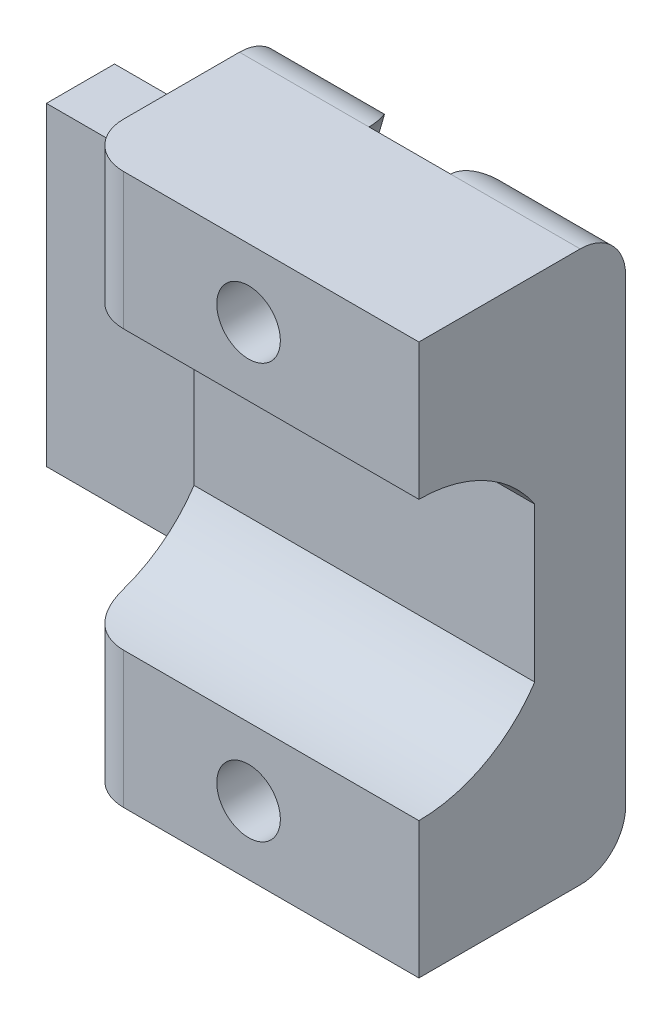
ISO-10303-21;
HEADER;
FILE_DESCRIPTION(('STEP AP214'),'2;1');
FILE_NAME('part.step','',(''),(''),'','','');
FILE_SCHEMA(('AUTOMOTIVE_DESIGN { 1 0 10303 214 1 1 1 1 }'));
ENDSEC;
DATA;
#1=APPLICATION_CONTEXT('core data for automotive mechanical design processes');
#2=APPLICATION_PROTOCOL_DEFINITION('international standard','automotive_design',2000,#1);
#3=PRODUCT_CONTEXT('',#1,'mechanical');
#4=PRODUCT('Part','Part','',(#3));
#5=PRODUCT_RELATED_PRODUCT_CATEGORY('part','',(#4));
#6=PRODUCT_DEFINITION_FORMATION('','',#4);
#7=PRODUCT_DEFINITION_CONTEXT('part definition',#1,'design');
#8=PRODUCT_DEFINITION('design','',#6,#7);
#9=PRODUCT_DEFINITION_SHAPE('','',#8);
#10=(LENGTH_UNIT() NAMED_UNIT(*) SI_UNIT(.MILLI.,.METRE.));
#11=(NAMED_UNIT(*) PLANE_ANGLE_UNIT() SI_UNIT($,.RADIAN.));
#12=(NAMED_UNIT(*) SI_UNIT($,.STERADIAN.) SOLID_ANGLE_UNIT());
#13=UNCERTAINTY_MEASURE_WITH_UNIT(LENGTH_MEASURE(1.E-05),#10,'distance_accuracy_value','');
#14=(GEOMETRIC_REPRESENTATION_CONTEXT(3) GLOBAL_UNCERTAINTY_ASSIGNED_CONTEXT((#13)) GLOBAL_UNIT_ASSIGNED_CONTEXT((#10,
#11,#12)) REPRESENTATION_CONTEXT('',''));
#15=CARTESIAN_POINT('',(0.,0.,0.));
#16=DIRECTION('',(0.,0.,1.));
#17=DIRECTION('',(1.,0.,0.));
#18=AXIS2_PLACEMENT_3D('',#15,#16,#17);
#19=CARTESIAN_POINT('',(-51.2,12.125,0.));
#20=DIRECTION('',(0.,0.,-1.));
#21=DIRECTION('',(0.,1.,0.));
#22=AXIS2_PLACEMENT_3D('',#19,#20,#21);
#23=PLANE('',#22);
#24=CARTESIAN_POINT('',(-7.50000000000001,9.12499999999999,0.));
#25=DIRECTION('',(0.,0.,-1.));
#26=DIRECTION('',(0.,1.,0.));
#27=AXIS2_PLACEMENT_3D('',#24,#25,#26);
#28=CIRCLE('',#27,1.4);
#29=CARTESIAN_POINT('',(-7.50000000000001,10.525,0.));
#30=VERTEX_POINT('',#29);
#31=EDGE_CURVE('E280',#30,#30,#28,.F.);
#32=ORIENTED_EDGE('',*,*,#31,.F.);
#33=EDGE_LOOP('',(#32));
#34=FACE_BOUND('',#33,.T.);
#35=DIRECTION('',(1.,0.,0.));
#36=VECTOR('',#35,1.);
#37=CARTESIAN_POINT('',(-51.2,12.125,0.));
#38=LINE('',#37,#36);
#39=CARTESIAN_POINT('',(-13.,12.125,0.));
#40=VERTEX_POINT('',#39);
#41=CARTESIAN_POINT('',(0.,12.125,0.));
#42=VERTEX_POINT('',#41);
#43=EDGE_CURVE('E269',#40,#42,#38,.T.);
#44=ORIENTED_EDGE('',*,*,#43,.F.);
#45=DIRECTION('',(0.,1.,0.));
#46=VECTOR('',#45,1.);
#47=CARTESIAN_POINT('',(-13.,12.125,0.));
#48=LINE('',#47,#46);
#49=CARTESIAN_POINT('',(-13.,6.125,0.));
#50=VERTEX_POINT('',#49);
#51=EDGE_CURVE('E64',#40,#50,#48,.F.);
#52=ORIENTED_EDGE('',*,*,#51,.T.);
#53=DIRECTION('',(1.,0.,0.));
#54=VECTOR('',#53,1.);
#55=CARTESIAN_POINT('',(-15.,6.125,0.));
#56=LINE('',#55,#54);
#57=CARTESIAN_POINT('',(0.,6.125,0.));
#58=VERTEX_POINT('',#57);
#59=EDGE_CURVE('E272',#58,#50,#56,.F.);
#60=ORIENTED_EDGE('',*,*,#59,.F.);
#61=DIRECTION('',(0.,1.,0.));
#62=VECTOR('',#61,1.);
#63=CARTESIAN_POINT('',(0.,12.125,0.));
#64=LINE('',#63,#62);
#65=EDGE_CURVE('E263',#58,#42,#64,.T.);
#66=ORIENTED_EDGE('',*,*,#65,.T.);
#67=EDGE_LOOP('',(#44,#52,#60,#66));
#68=FACE_BOUND('',#67,.T.);
#69=ADVANCED_FACE('F49',(#34,#68),#23,.F.);
#70=CARTESIAN_POINT('',(-7.5,-9.125,-9.1));
#71=DIRECTION('',(0.,0.,1.));
#72=DIRECTION('',(1.,0.,0.));
#73=AXIS2_PLACEMENT_3D('',#70,#71,#72);
#74=CYLINDRICAL_SURFACE('',#73,1.4);
#75=CARTESIAN_POINT('',(-7.5,-9.125,0.));
#76=DIRECTION('',(0.,0.,-1.));
#77=DIRECTION('',(0.,1.,0.));
#78=AXIS2_PLACEMENT_3D('',#75,#76,#77);
#79=CIRCLE('',#78,1.4);
#80=CARTESIAN_POINT('',(-7.5,-7.725,0.));
#81=VERTEX_POINT('',#80);
#82=EDGE_CURVE('E284',#81,#81,#79,.F.);
#83=ORIENTED_EDGE('',*,*,#82,.T.);
#84=EDGE_LOOP('',(#83));
#85=FACE_BOUND('',#84,.T.);
#86=CARTESIAN_POINT('',(-7.5,-9.125,-7.1));
#87=DIRECTION('',(0.,0.,-1.));
#88=DIRECTION('',(-1.,0.,0.));
#89=AXIS2_PLACEMENT_3D('',#86,#87,#88);
#90=CIRCLE('',#89,1.4);
#91=CARTESIAN_POINT('',(-8.9,-9.125,-7.1));
#92=VERTEX_POINT('',#91);
#93=EDGE_CURVE('E293',#92,#92,#90,.F.);
#94=ORIENTED_EDGE('',*,*,#93,.F.);
#95=EDGE_LOOP('',(#94));
#96=FACE_BOUND('',#95,.T.);
#97=ADVANCED_FACE('F421',(#85,#96),#74,.F.);
#98=CARTESIAN_POINT('',(-7.50000000000001,9.12499999999999,-9.1));
#99=DIRECTION('',(0.,0.,1.));
#100=DIRECTION('',(1.,0.,0.));
#101=AXIS2_PLACEMENT_3D('',#98,#99,#100);
#102=CYLINDRICAL_SURFACE('',#101,1.4);
#103=ORIENTED_EDGE('',*,*,#31,.T.);
#104=EDGE_LOOP('',(#103));
#105=FACE_BOUND('',#104,.T.);
#106=CARTESIAN_POINT('',(-7.50000000000001,9.12499999999999,-7.1));
#107=DIRECTION('',(0.,0.,1.));
#108=DIRECTION('',(1.,0.,0.));
#109=AXIS2_PLACEMENT_3D('',#106,#107,#108);
#110=CIRCLE('',#109,1.4);
#111=CARTESIAN_POINT('',(-6.10000000000001,9.12499999999999,-7.1));
#112=VERTEX_POINT('',#111);
#113=EDGE_CURVE('E309',#112,#112,#110,.F.);
#114=ORIENTED_EDGE('',*,*,#113,.T.);
#115=EDGE_LOOP('',(#114));
#116=FACE_BOUND('',#115,.T.);
#117=ADVANCED_FACE('F424',(#105,#116),#102,.F.);
#118=CARTESIAN_POINT('',(-15.,-12.125,9.1));
#119=DIRECTION('',(0.,-1.,0.));
#120=DIRECTION('',(0.,0.,-1.));
#121=AXIS2_PLACEMENT_3D('',#118,#119,#120);
#122=PLANE('',#121);
#123=DIRECTION('',(1.,0.,0.));
#124=VECTOR('',#123,1.);
#125=CARTESIAN_POINT('',(-51.2,-12.125,0.));
#126=LINE('',#125,#124);
#127=CARTESIAN_POINT('',(-13.,-12.125,0.));
#128=VERTEX_POINT('',#127);
#129=CARTESIAN_POINT('',(0.,-12.125,0.));
#130=VERTEX_POINT('',#129);
#131=EDGE_CURVE('E268',#128,#130,#126,.T.);
#132=ORIENTED_EDGE('',*,*,#131,.F.);
#133=CARTESIAN_POINT('',(-13.,-12.125,-2.));
#134=DIRECTION('',(0.,-1.,0.));
#135=DIRECTION('',(0.,0.,-1.));
#136=AXIS2_PLACEMENT_3D('',#133,#134,#135);
#137=CIRCLE('',#136,2.);
#138=CARTESIAN_POINT('',(-15.,-12.125,-2.));
#139=VERTEX_POINT('',#138);
#140=EDGE_CURVE('E510',#128,#139,#137,.T.);
#141=ORIENTED_EDGE('',*,*,#140,.T.);
#142=DIRECTION('',(0.,0.,1.));
#143=VECTOR('',#142,1.);
#144=CARTESIAN_POINT('',(-15.,-12.125,-9.1));
#145=LINE('',#144,#143);
#146=CARTESIAN_POINT('',(-15.,-12.125,-7.1));
#147=VERTEX_POINT('',#146);
#148=EDGE_CURVE('E204',#147,#139,#145,.T.);
#149=ORIENTED_EDGE('',*,*,#148,.F.);
#150=DIRECTION('',(1.,0.,0.));
#151=VECTOR('',#150,1.);
#152=CARTESIAN_POINT('',(-15.,-12.125,-7.1));
#153=LINE('',#152,#151);
#154=CARTESIAN_POINT('',(-9.30277563773199,-12.125,-7.1));
#155=VERTEX_POINT('',#154);
#156=EDGE_CURVE('E535',#147,#155,#153,.T.);
#157=ORIENTED_EDGE('',*,*,#156,.T.);
#158=DIRECTION('',(1.,0.,0.));
#159=VECTOR('',#158,1.);
#160=CARTESIAN_POINT('',(-15.,-12.125,-7.1));
#161=LINE('',#160,#159);
#162=CARTESIAN_POINT('',(-5.69722436226801,-12.125,-7.1));
#163=VERTEX_POINT('',#162);
#164=EDGE_CURVE('E305',#155,#163,#161,.T.);
#165=ORIENTED_EDGE('',*,*,#164,.T.);
#166=DIRECTION('',(1.,0.,0.));
#167=VECTOR('',#166,1.);
#168=CARTESIAN_POINT('',(-15.,-12.125,-7.1));
#169=LINE('',#168,#167);
#170=CARTESIAN_POINT('',(0.,-12.125,-7.1));
#171=VERTEX_POINT('',#170);
#172=EDGE_CURVE('E485',#163,#171,#169,.T.);
#173=ORIENTED_EDGE('',*,*,#172,.T.);
#174=DIRECTION('',(0.,0.,-1.));
#175=VECTOR('',#174,1.);
#176=CARTESIAN_POINT('',(0.,-12.125,9.1));
#177=LINE('',#176,#175);
#178=EDGE_CURVE('E342',#130,#171,#177,.T.);
#179=ORIENTED_EDGE('',*,*,#178,.F.);
#180=EDGE_LOOP('',(#132,#141,#149,#157,#165,#173,#179));
#181=FACE_BOUND('',#180,.T.);
#182=ADVANCED_FACE('F428',(#181),#122,.T.);
#183=CARTESIAN_POINT('',(-15.,12.125,9.1));
#184=DIRECTION('',(0.,1.,0.));
#185=DIRECTION('',(0.,0.,1.));
#186=AXIS2_PLACEMENT_3D('',#183,#184,#185);
#187=PLANE('',#186);
#188=DIRECTION('',(0.,0.,1.));
#189=VECTOR('',#188,1.);
#190=CARTESIAN_POINT('',(-15.,12.125,-9.1));
#191=LINE('',#190,#189);
#192=CARTESIAN_POINT('',(-15.,12.125,-7.1));
#193=VERTEX_POINT('',#192);
#194=CARTESIAN_POINT('',(-15.,12.125,-2.));
#195=VERTEX_POINT('',#194);
#196=EDGE_CURVE('E234',#193,#195,#191,.T.);
#197=ORIENTED_EDGE('',*,*,#196,.T.);
#198=CARTESIAN_POINT('',(-13.,12.125,-2.));
#199=DIRECTION('',(0.,1.,0.));
#200=DIRECTION('',(0.,0.,1.));
#201=AXIS2_PLACEMENT_3D('',#198,#199,#200);
#202=CIRCLE('',#201,2.);
#203=EDGE_CURVE('E78',#195,#40,#202,.T.);
#204=ORIENTED_EDGE('',*,*,#203,.T.);
#205=ORIENTED_EDGE('',*,*,#43,.T.);
#206=DIRECTION('',(0.,0.,1.));
#207=VECTOR('',#206,1.);
#208=CARTESIAN_POINT('',(0.,12.125,9.1));
#209=LINE('',#208,#207);
#210=CARTESIAN_POINT('',(0.,12.125,-7.1));
#211=VERTEX_POINT('',#210);
#212=EDGE_CURVE('E352',#211,#42,#209,.T.);
#213=ORIENTED_EDGE('',*,*,#212,.F.);
#214=DIRECTION('',(1.,0.,0.));
#215=VECTOR('',#214,1.);
#216=CARTESIAN_POINT('',(-15.,12.125,-7.1));
#217=LINE('',#216,#215);
#218=CARTESIAN_POINT('',(-5.697224362268,12.125,-7.1));
#219=VERTEX_POINT('',#218);
#220=EDGE_CURVE('E384',#211,#219,#217,.F.);
#221=ORIENTED_EDGE('',*,*,#220,.T.);
#222=DIRECTION('',(1.,0.,0.));
#223=VECTOR('',#222,1.);
#224=CARTESIAN_POINT('',(-15.,12.125,-7.1));
#225=LINE('',#224,#223);
#226=CARTESIAN_POINT('',(-9.30277563773198,12.125,-7.1));
#227=VERTEX_POINT('',#226);
#228=EDGE_CURVE('E310',#227,#219,#225,.T.);
#229=ORIENTED_EDGE('',*,*,#228,.F.);
#230=DIRECTION('',(1.,0.,0.));
#231=VECTOR('',#230,1.);
#232=CARTESIAN_POINT('',(-15.,12.125,-7.1));
#233=LINE('',#232,#231);
#234=EDGE_CURVE('E380',#227,#193,#233,.F.);
#235=ORIENTED_EDGE('',*,*,#234,.T.);
#236=EDGE_LOOP('',(#197,#204,#205,#213,#221,#229,#235));
#237=FACE_BOUND('',#236,.T.);
#238=ADVANCED_FACE('F551',(#237),#187,.T.);
#239=CARTESIAN_POINT('',(-15.,-12.125,-9.1));
#240=DIRECTION('',(0.,0.,-1.));
#241=DIRECTION('',(-1.,0.,0.));
#242=AXIS2_PLACEMENT_3D('',#239,#240,#241);
#243=PLANE('',#242);
#244=DIRECTION('',(0.,1.,0.));
#245=VECTOR('',#244,1.);
#246=CARTESIAN_POINT('',(-15.,12.125,-9.1));
#247=LINE('',#246,#245);
#248=CARTESIAN_POINT('',(-15.,6.925,-9.1));
#249=VERTEX_POINT('',#248);
#250=CARTESIAN_POINT('',(-15.,10.125,-9.1));
#251=VERTEX_POINT('',#250);
#252=EDGE_CURVE('E231',#249,#251,#247,.T.);
#253=ORIENTED_EDGE('',*,*,#252,.T.);
#254=DIRECTION('',(1.,0.,0.));
#255=VECTOR('',#254,1.);
#256=CARTESIAN_POINT('',(-15.,10.125,-9.1));
#257=LINE('',#256,#255);
#258=CARTESIAN_POINT('',(-10.8541019662497,10.125,-9.1));
#259=VERTEX_POINT('',#258);
#260=EDGE_CURVE('E367',#251,#259,#257,.T.);
#261=ORIENTED_EDGE('',*,*,#260,.T.);
#262=CARTESIAN_POINT('',(-7.49999999999999,9.12499999999999,-9.1));
#263=DIRECTION('',(0.,0.,-1.));
#264=DIRECTION('',(1.,0.,0.));
#265=AXIS2_PLACEMENT_3D('',#262,#263,#264);
#266=CIRCLE('',#265,3.5);
#267=CARTESIAN_POINT('',(-4.14589803375031,10.125,-9.1));
#268=VERTEX_POINT('',#267);
#269=EDGE_CURVE('E298',#268,#259,#266,.T.);
#270=ORIENTED_EDGE('',*,*,#269,.F.);
#271=DIRECTION('',(1.,0.,0.));
#272=VECTOR('',#271,1.);
#273=CARTESIAN_POINT('',(-15.,10.125,-9.1));
#274=LINE('',#273,#272);
#275=CARTESIAN_POINT('',(0.,10.125,-9.1));
#276=VERTEX_POINT('',#275);
#277=EDGE_CURVE('E370',#268,#276,#274,.T.);
#278=ORIENTED_EDGE('',*,*,#277,.T.);
#279=DIRECTION('',(0.,1.,0.));
#280=VECTOR('',#279,1.);
#281=CARTESIAN_POINT('',(0.,-12.125,-9.1));
#282=LINE('',#281,#280);
#283=CARTESIAN_POINT('',(0.,-10.125,-9.1));
#284=VERTEX_POINT('',#283);
#285=EDGE_CURVE('E348',#284,#276,#282,.T.);
#286=ORIENTED_EDGE('',*,*,#285,.F.);
#287=DIRECTION('',(1.,0.,0.));
#288=VECTOR('',#287,1.);
#289=CARTESIAN_POINT('',(-15.,-10.125,-9.1));
#290=LINE('',#289,#288);
#291=CARTESIAN_POINT('',(-4.14589803375032,-10.125,-9.1));
#292=VERTEX_POINT('',#291);
#293=EDGE_CURVE('E364',#284,#292,#290,.F.);
#294=ORIENTED_EDGE('',*,*,#293,.T.);
#295=CARTESIAN_POINT('',(-7.5,-9.125,-9.1));
#296=DIRECTION('',(0.,0.,-1.));
#297=DIRECTION('',(-1.,0.,0.));
#298=AXIS2_PLACEMENT_3D('',#295,#296,#297);
#299=CIRCLE('',#298,3.5);
#300=CARTESIAN_POINT('',(-10.8541019662497,-10.125,-9.1));
#301=VERTEX_POINT('',#300);
#302=EDGE_CURVE('E294',#301,#292,#299,.T.);
#303=ORIENTED_EDGE('',*,*,#302,.F.);
#304=DIRECTION('',(1.,0.,0.));
#305=VECTOR('',#304,1.);
#306=CARTESIAN_POINT('',(-15.,-10.125,-9.1));
#307=LINE('',#306,#305);
#308=CARTESIAN_POINT('',(-15.,-10.125,-9.1));
#309=VERTEX_POINT('',#308);
#310=EDGE_CURVE('E221',#301,#309,#307,.F.);
#311=ORIENTED_EDGE('',*,*,#310,.T.);
#312=DIRECTION('',(0.,1.,0.));
#313=VECTOR('',#312,1.);
#314=CARTESIAN_POINT('',(-15.,-6.925,-9.1));
#315=LINE('',#314,#313);
#316=CARTESIAN_POINT('',(-15.,-6.925,-9.1));
#317=VERTEX_POINT('',#316);
#318=EDGE_CURVE('E195',#309,#317,#315,.T.);
#319=ORIENTED_EDGE('',*,*,#318,.T.);
#320=DIRECTION('',(-1.,0.,0.));
#321=VECTOR('',#320,1.);
#322=CARTESIAN_POINT('',(-22.5,-6.925,-9.1));
#323=LINE('',#322,#321);
#324=CARTESIAN_POINT('',(-22.5,-6.925,-9.1));
#325=VERTEX_POINT('',#324);
#326=EDGE_CURVE('E207',#317,#325,#323,.T.);
#327=ORIENTED_EDGE('',*,*,#326,.T.);
#328=DIRECTION('',(0.,1.,0.));
#329=VECTOR('',#328,1.);
#330=CARTESIAN_POINT('',(-22.5,6.925,-9.1));
#331=LINE('',#330,#329);
#332=CARTESIAN_POINT('',(-22.5,6.925,-9.1));
#333=VERTEX_POINT('',#332);
#334=EDGE_CURVE('E214',#325,#333,#331,.T.);
#335=ORIENTED_EDGE('',*,*,#334,.T.);
#336=DIRECTION('',(1.,0.,0.));
#337=VECTOR('',#336,1.);
#338=CARTESIAN_POINT('',(-15.,6.925,-9.1));
#339=LINE('',#338,#337);
#340=EDGE_CURVE('E227',#333,#249,#339,.T.);
#341=ORIENTED_EDGE('',*,*,#340,.T.);
#342=EDGE_LOOP('',(#253,#261,#270,#278,#286,#294,#303,#311,#319,#327,#335,#341));
#343=FACE_BOUND('',#342,.T.);
#344=ADVANCED_FACE('F218',(#343),#243,.T.);
#345=CARTESIAN_POINT('',(-15.,0.,0.));
#346=DIRECTION('',(1.,0.,0.));
#347=DIRECTION('',(0.,0.,-1.));
#348=AXIS2_PLACEMENT_3D('',#345,#346,#347);
#349=PLANE('',#348);
#350=ORIENTED_EDGE('',*,*,#148,.T.);
#351=DIRECTION('',(0.,1.,0.));
#352=VECTOR('',#351,1.);
#353=CARTESIAN_POINT('',(-15.,0.,-2.));
#354=LINE('',#353,#352);
#355=CARTESIAN_POINT('',(-15.,-5.78926808845471,-2.));
#356=VERTEX_POINT('',#355);
#357=EDGE_CURVE('E460',#139,#356,#354,.T.);
#358=ORIENTED_EDGE('',*,*,#357,.T.);
#359=CARTESIAN_POINT('',(-15.,0.,0.));
#360=DIRECTION('',(1.,0.,0.));
#361=DIRECTION('',(0.,0.,-1.));
#362=AXIS2_PLACEMENT_3D('',#359,#360,#361);
#363=CIRCLE('',#362,6.125);
#364=CARTESIAN_POINT('',(-15.,-3.39199425117438,-5.1));
#365=VERTEX_POINT('',#364);
#366=EDGE_CURVE('E317',#356,#365,#363,.T.);
#367=ORIENTED_EDGE('',*,*,#366,.T.);
#368=DIRECTION('',(0.,1.,0.));
#369=VECTOR('',#368,1.);
#370=CARTESIAN_POINT('',(-15.,3.39199425117438,-5.1));
#371=LINE('',#370,#369);
#372=CARTESIAN_POINT('',(-15.,3.39199425117438,-5.1));
#373=VERTEX_POINT('',#372);
#374=EDGE_CURVE('E320',#365,#373,#371,.T.);
#375=ORIENTED_EDGE('',*,*,#374,.T.);
#376=CARTESIAN_POINT('',(-15.,0.,0.));
#377=DIRECTION('',(1.,0.,0.));
#378=DIRECTION('',(0.,0.,-1.));
#379=AXIS2_PLACEMENT_3D('',#376,#377,#378);
#380=CIRCLE('',#379,6.125);
#381=CARTESIAN_POINT('',(-15.,5.78926808845471,-2.));
#382=VERTEX_POINT('',#381);
#383=EDGE_CURVE('E325',#373,#382,#380,.T.);
#384=ORIENTED_EDGE('',*,*,#383,.T.);
#385=DIRECTION('',(0.,1.,0.));
#386=VECTOR('',#385,1.);
#387=CARTESIAN_POINT('',(-15.,0.,-2.));
#388=LINE('',#387,#386);
#389=EDGE_CURVE('E491',#382,#195,#388,.T.);
#390=ORIENTED_EDGE('',*,*,#389,.T.);
#391=ORIENTED_EDGE('',*,*,#196,.F.);
#392=CARTESIAN_POINT('',(-15.,10.125,-7.1));
#393=DIRECTION('',(1.,0.,0.));
#394=DIRECTION('',(0.,0.,-1.));
#395=AXIS2_PLACEMENT_3D('',#392,#393,#394);
#396=CIRCLE('',#395,2.);
#397=EDGE_CURVE('E260',#193,#251,#396,.F.);
#398=ORIENTED_EDGE('',*,*,#397,.T.);
#399=ORIENTED_EDGE('',*,*,#252,.F.);
#400=DIRECTION('',(0.,0.,1.));
#401=VECTOR('',#400,1.);
#402=CARTESIAN_POINT('',(-15.,6.925,-9.1));
#403=LINE('',#402,#401);
#404=CARTESIAN_POINT('',(-15.,6.925,-6.1));
#405=VERTEX_POINT('',#404);
#406=EDGE_CURVE('E238',#249,#405,#403,.T.);
#407=ORIENTED_EDGE('',*,*,#406,.T.);
#408=DIRECTION('',(0.,-1.,0.));
#409=VECTOR('',#408,1.);
#410=CARTESIAN_POINT('',(-15.,0.,-6.1));
#411=LINE('',#410,#409);
#412=CARTESIAN_POINT('',(-15.,-6.925,-6.1));
#413=VERTEX_POINT('',#412);
#414=EDGE_CURVE('E199',#405,#413,#411,.T.);
#415=ORIENTED_EDGE('',*,*,#414,.T.);
#416=DIRECTION('',(0.,0.,1.));
#417=VECTOR('',#416,1.);
#418=CARTESIAN_POINT('',(-15.,-6.925,-9.1));
#419=LINE('',#418,#417);
#420=EDGE_CURVE('E190',#317,#413,#419,.T.);
#421=ORIENTED_EDGE('',*,*,#420,.F.);
#422=ORIENTED_EDGE('',*,*,#318,.F.);
#423=CARTESIAN_POINT('',(-15.,-10.125,-7.1));
#424=DIRECTION('',(1.,0.,0.));
#425=DIRECTION('',(0.,0.,-1.));
#426=AXIS2_PLACEMENT_3D('',#423,#424,#425);
#427=CIRCLE('',#426,2.);
#428=EDGE_CURVE('E237',#309,#147,#427,.F.);
#429=ORIENTED_EDGE('',*,*,#428,.T.);
#430=EDGE_LOOP('',(#350,#358,#367,#375,#384,#390,#391,#398,#399,#407,#415,#421,#422,#429));
#431=FACE_BOUND('',#430,.T.);
#432=ADVANCED_FACE('F193',(#431),#349,.F.);
#433=CARTESIAN_POINT('',(0.,0.,0.));
#434=DIRECTION('',(1.,0.,0.));
#435=DIRECTION('',(0.,0.,-1.));
#436=AXIS2_PLACEMENT_3D('',#433,#434,#435);
#437=PLANE('',#436);
#438=CARTESIAN_POINT('',(0.,-6.125,0.));
#439=VERTEX_POINT('',#438);
#440=EDGE_CURVE('E264',#130,#439,#64,.T.);
#441=ORIENTED_EDGE('',*,*,#440,.F.);
#442=ORIENTED_EDGE('',*,*,#178,.T.);
#443=CARTESIAN_POINT('',(0.,-10.125,-7.1));
#444=DIRECTION('',(1.,0.,0.));
#445=DIRECTION('',(0.,0.,-1.));
#446=AXIS2_PLACEMENT_3D('',#443,#444,#445);
#447=CIRCLE('',#446,2.);
#448=EDGE_CURVE('E374',#171,#284,#447,.T.);
#449=ORIENTED_EDGE('',*,*,#448,.T.);
#450=ORIENTED_EDGE('',*,*,#285,.T.);
#451=CARTESIAN_POINT('',(0.,10.125,-7.1));
#452=DIRECTION('',(1.,0.,0.));
#453=DIRECTION('',(0.,0.,-1.));
#454=AXIS2_PLACEMENT_3D('',#451,#452,#453);
#455=CIRCLE('',#454,2.);
#456=EDGE_CURVE('E377',#276,#211,#455,.T.);
#457=ORIENTED_EDGE('',*,*,#456,.T.);
#458=ORIENTED_EDGE('',*,*,#212,.T.);
#459=ORIENTED_EDGE('',*,*,#65,.F.);
#460=CARTESIAN_POINT('',(0.,0.,0.));
#461=DIRECTION('',(1.,0.,0.));
#462=DIRECTION('',(0.,0.,-1.));
#463=AXIS2_PLACEMENT_3D('',#460,#461,#462);
#464=CIRCLE('',#463,6.125);
#465=CARTESIAN_POINT('',(0.,3.39199425117438,-5.1));
#466=VERTEX_POINT('',#465);
#467=EDGE_CURVE('E321',#466,#58,#464,.T.);
#468=ORIENTED_EDGE('',*,*,#467,.F.);
#469=DIRECTION('',(0.,1.,0.));
#470=VECTOR('',#469,1.);
#471=CARTESIAN_POINT('',(0.,3.39199425117438,-5.1));
#472=LINE('',#471,#470);
#473=CARTESIAN_POINT('',(0.,-3.39199425117438,-5.1));
#474=VERTEX_POINT('',#473);
#475=EDGE_CURVE('E332',#474,#466,#472,.T.);
#476=ORIENTED_EDGE('',*,*,#475,.F.);
#477=CARTESIAN_POINT('',(0.,0.,0.));
#478=DIRECTION('',(1.,0.,0.));
#479=DIRECTION('',(0.,0.,-1.));
#480=AXIS2_PLACEMENT_3D('',#477,#478,#479);
#481=CIRCLE('',#480,6.125);
#482=EDGE_CURVE('E316',#439,#474,#481,.T.);
#483=ORIENTED_EDGE('',*,*,#482,.F.);
#484=EDGE_LOOP('',(#441,#442,#449,#450,#457,#458,#459,#468,#476,#483));
#485=FACE_BOUND('',#484,.T.);
#486=ADVANCED_FACE('F447',(#485),#437,.T.);
#487=CARTESIAN_POINT('',(-15.,0.,0.));
#488=DIRECTION('',(1.,0.,0.));
#489=DIRECTION('',(0.,0.,-1.));
#490=AXIS2_PLACEMENT_3D('',#487,#488,#489);
#491=CYLINDRICAL_SURFACE('',#490,6.125);
#492=ORIENTED_EDGE('',*,*,#366,.F.);
#493=CARTESIAN_POINT('',(-15.,-5.78926808845471,-2.));
#494=CARTESIAN_POINT('',(-14.9999995852952,-5.80755390429279,-1.94707976188175));
#495=CARTESIAN_POINT('',(-14.997897657632,-5.82510042572185,-1.89392414016655));
#496=CARTESIAN_POINT('',(-14.9893922090849,-5.85864686452545,-1.78745457651548));
#497=CARTESIAN_POINT('',(-14.9829875066557,-5.87464635570338,-1.73414059509847));
#498=CARTESIAN_POINT('',(-14.9571883203699,-5.92018066685748,-1.57456876582142));
#499=CARTESIAN_POINT('',(-14.9312090990174,-5.94728415168171,-1.46858560749514));
#500=CARTESIAN_POINT('',(-14.8616103292676,-5.99478782770625,-1.26077640782113));
#501=CARTESIAN_POINT('',(-14.8179539660181,-6.01517386728399,-1.1589595335503));
#502=CARTESIAN_POINT('',(-14.7138633535338,-6.04960620297019,-0.963204893329345));
#503=CARTESIAN_POINT('',(-14.6534414664115,-6.0636571503179,-0.869261388126121));
#504=CARTESIAN_POINT('',(-14.5192524073805,-6.08609021630977,-0.694753778659296));
#505=CARTESIAN_POINT('',(-14.4458866301655,-6.09461426945827,-0.613898407585268));
#506=CARTESIAN_POINT('',(-14.2867637494217,-6.10777892657835,-0.465036392108601));
#507=CARTESIAN_POINT('',(-14.2010017471558,-6.11241799033377,-0.397034851911933));
#508=CARTESIAN_POINT('',(-14.0185513205253,-6.11911964995023,-0.275265414612252));
#509=CARTESIAN_POINT('',(-13.9217599114551,-6.12115534984246,-0.221650555483187));
#510=CARTESIAN_POINT('',(-13.7206673106302,-6.12376471765783,-0.131099408596584));
#511=CARTESIAN_POINT('',(-13.6163685957876,-6.12433886554301,-0.0941576488052258));
#512=CARTESIAN_POINT('',(-13.4266569573418,-6.12488151794896,-0.0441478709753654));
#513=CARTESIAN_POINT('',(-13.3421390775155,-6.1249554995577,-0.0276150864453091));
#514=CARTESIAN_POINT('',(-13.1717573116223,-6.1249996572185,-0.00553345886195305));
#515=CARTESIAN_POINT('',(-13.0858946832043,-6.12496992509696,2.50937659872925E-05));
#516=CARTESIAN_POINT('',(-13.,-6.125,0.));
#517=B_SPLINE_CURVE_WITH_KNOTS('',3,(#493,#494,#495,#496,#497,#498,#499,#500,#501,#502,#503,
#504,#505,#506,#507,#508,#509,#510,#511,#512,#513,#514,#515,#516),.UNSPECIFIED.,.F.,.F.,(4,2,2,
2,2,2,2,2,2,2,2,4),(0.,0.167883986123141,0.335814092178839,0.671375273590608,1.00763892722021,
1.34365529165628,1.67065945524741,1.99779319936891,2.32828003758224,2.65865833253669,
2.91633065338733,3.1737748934163),.UNSPECIFIED.);
#518=CARTESIAN_POINT('',(-13.,-6.125,0.));
#519=VERTEX_POINT('',#518);
#520=EDGE_CURVE('E451',#356,#519,#517,.T.);
#521=ORIENTED_EDGE('',*,*,#520,.T.);
#522=DIRECTION('',(1.,0.,0.));
#523=VECTOR('',#522,1.);
#524=CARTESIAN_POINT('',(-15.,-6.125,0.));
#525=LINE('',#524,#523);
#526=EDGE_CURVE('E277',#519,#439,#525,.T.);
#527=ORIENTED_EDGE('',*,*,#526,.T.);
#528=ORIENTED_EDGE('',*,*,#482,.T.);
#529=DIRECTION('',(1.,0.,0.));
#530=VECTOR('',#529,1.);
#531=CARTESIAN_POINT('',(-15.,-3.39199425117438,-5.1));
#532=LINE('',#531,#530);
#533=EDGE_CURVE('E329',#365,#474,#532,.T.);
#534=ORIENTED_EDGE('',*,*,#533,.F.);
#535=EDGE_LOOP('',(#492,#521,#527,#528,#534));
#536=FACE_BOUND('',#535,.T.);
#537=ADVANCED_FACE('F439',(#536),#491,.F.);
#538=CARTESIAN_POINT('',(-15.,0.,0.));
#539=DIRECTION('',(1.,0.,0.));
#540=DIRECTION('',(0.,0.,-1.));
#541=AXIS2_PLACEMENT_3D('',#538,#539,#540);
#542=CYLINDRICAL_SURFACE('',#541,6.125);
#543=ORIENTED_EDGE('',*,*,#59,.T.);
#544=CARTESIAN_POINT('',(-13.,6.125,0.));
#545=CARTESIAN_POINT('',(-13.0562100731713,6.12499555259973,-3.81888026178138E-07));
#546=CARTESIAN_POINT('',(-13.1123932343482,6.12500050059459,-0.00237116523762545));
#547=CARTESIAN_POINT('',(-13.2243586076157,6.12499126894007,-0.0118292667148865));
#548=CARTESIAN_POINT('',(-13.2801408370342,6.12497709012239,-0.0189163797540451));
#549=CARTESIAN_POINT('',(-13.4462109094815,6.12484911864216,-0.0471885583401504));
#550=CARTESIAN_POINT('',(-13.5553884036321,6.12465009930582,-0.0753846257273355));
#551=CARTESIAN_POINT('',(-13.7674667520325,6.12328201018951,-0.149690969813706));
#552=CARTESIAN_POINT('',(-13.8703641928316,6.12211241781894,-0.195810890230171));
#553=CARTESIAN_POINT('',(-14.066934383103,6.11766099664524,-0.304635676671864));
#554=CARTESIAN_POINT('',(-14.1606086388628,6.11437951340815,-0.367337828378713));
#555=CARTESIAN_POINT('',(-14.3356204031641,6.10436736664331,-0.507147685455815));
#556=CARTESIAN_POINT('',(-14.4170107601431,6.09765205796155,-0.584190298197732));
#557=CARTESIAN_POINT('',(-14.5655740616742,6.07942715012592,-0.750441475032504));
#558=CARTESIAN_POINT('',(-14.6327504203259,6.06791870422468,-0.839647109171558));
#559=CARTESIAN_POINT('',(-14.749955711039,6.03924747547019,-1.02556880716947));
#560=CARTESIAN_POINT('',(-14.8002729400369,6.02219078006209,-1.12211975417982));
#561=CARTESIAN_POINT('',(-14.8842978123314,5.98171539992175,-1.32098000196493));
#562=CARTESIAN_POINT('',(-14.9180033199818,5.95829589777054,-1.42329004126073));
#563=CARTESIAN_POINT('',(-14.9623105791662,5.91147199566498,-1.60520462699752));
#564=CARTESIAN_POINT('',(-14.9765300852057,5.88943643963568,-1.68430994589019));
#565=CARTESIAN_POINT('',(-14.9953790704554,5.84190302840764,-1.84246960005527));
#566=CARTESIAN_POINT('',(-15.0000259103737,5.81641153048537,-1.92152376723133));
#567=CARTESIAN_POINT('',(-15.,5.78926808845471,-2.));
#568=B_SPLINE_CURVE_WITH_KNOTS('',3,(#544,#545,#546,#547,#548,#549,#550,#551,#552,#553,#554,
#555,#556,#557,#558,#559,#560,#561,#562,#563,#564,#565,#566,#567),.UNSPECIFIED.,.F.,.F.,(4,2,2,
2,2,2,2,2,2,2,2,4),(0.,0.168526778843545,0.337046229818001,0.673592666669132,1.01032042959875,
1.34699310818947,1.68217330288255,2.0172728981009,2.34630864431397,2.67538668119498,
2.92479996122797,3.17376051296831),.UNSPECIFIED.);
#569=EDGE_CURVE('E11',#50,#382,#568,.T.);
#570=ORIENTED_EDGE('',*,*,#569,.T.);
#571=ORIENTED_EDGE('',*,*,#383,.F.);
#572=DIRECTION('',(1.,0.,0.));
#573=VECTOR('',#572,1.);
#574=CARTESIAN_POINT('',(-15.,3.39199425117438,-5.1));
#575=LINE('',#574,#573);
#576=EDGE_CURVE('E339',#373,#466,#575,.T.);
#577=ORIENTED_EDGE('',*,*,#576,.T.);
#578=ORIENTED_EDGE('',*,*,#467,.T.);
#579=EDGE_LOOP('',(#543,#570,#571,#577,#578));
#580=FACE_BOUND('',#579,.T.);
#581=ADVANCED_FACE('F435',(#580),#542,.F.);
#582=CARTESIAN_POINT('',(-15.,3.39199425117438,-5.1));
#583=DIRECTION('',(0.,0.,-1.));
#584=DIRECTION('',(0.,1.,0.));
#585=AXIS2_PLACEMENT_3D('',#582,#583,#584);
#586=PLANE('',#585);
#587=ORIENTED_EDGE('',*,*,#475,.T.);
#588=ORIENTED_EDGE('',*,*,#576,.F.);
#589=ORIENTED_EDGE('',*,*,#374,.F.);
#590=ORIENTED_EDGE('',*,*,#533,.T.);
#591=EDGE_LOOP('',(#587,#588,#589,#590));
#592=FACE_BOUND('',#591,.T.);
#593=ADVANCED_FACE('F433',(#592),#586,.F.);
#594=CARTESIAN_POINT('',(-22.5,0.,-6.1));
#595=DIRECTION('',(0.,0.,1.));
#596=DIRECTION('',(1.,0.,0.));
#597=AXIS2_PLACEMENT_3D('',#594,#595,#596);
#598=PLANE('',#597);
#599=DIRECTION('',(1.,0.,0.));
#600=VECTOR('',#599,1.);
#601=CARTESIAN_POINT('',(-22.5,6.925,-6.1));
#602=LINE('',#601,#600);
#603=CARTESIAN_POINT('',(-22.5,6.925,-6.1));
#604=VERTEX_POINT('',#603);
#605=EDGE_CURVE('E257',#604,#405,#602,.T.);
#606=ORIENTED_EDGE('',*,*,#605,.F.);
#607=DIRECTION('',(0.,1.,0.));
#608=VECTOR('',#607,1.);
#609=CARTESIAN_POINT('',(-22.5,0.,-6.1));
#610=LINE('',#609,#608);
#611=CARTESIAN_POINT('',(-22.5,-6.925,-6.1));
#612=VERTEX_POINT('',#611);
#613=EDGE_CURVE('E254',#612,#604,#610,.T.);
#614=ORIENTED_EDGE('',*,*,#613,.F.);
#615=DIRECTION('',(-1.,0.,0.));
#616=VECTOR('',#615,1.);
#617=CARTESIAN_POINT('',(-22.5,-6.925,-6.1));
#618=LINE('',#617,#616);
#619=EDGE_CURVE('E251',#413,#612,#618,.T.);
#620=ORIENTED_EDGE('',*,*,#619,.F.);
#621=ORIENTED_EDGE('',*,*,#414,.F.);
#622=EDGE_LOOP('',(#606,#614,#620,#621));
#623=FACE_BOUND('',#622,.T.);
#624=ADVANCED_FACE('F430',(#623),#598,.T.);
#625=CARTESIAN_POINT('',(-7.5,-9.125,-7.1));
#626=DIRECTION('',(0.,0.,-1.));
#627=DIRECTION('',(-1.,0.,0.));
#628=AXIS2_PLACEMENT_3D('',#625,#626,#627);
#629=PLANE('',#628);
#630=CARTESIAN_POINT('',(-7.5,-9.125,-7.1));
#631=DIRECTION('',(0.,0.,-1.));
#632=DIRECTION('',(-1.,0.,0.));
#633=AXIS2_PLACEMENT_3D('',#630,#631,#632);
#634=CIRCLE('',#633,3.5);
#635=EDGE_CURVE('E289',#155,#163,#634,.T.);
#636=ORIENTED_EDGE('',*,*,#635,.T.);
#637=ORIENTED_EDGE('',*,*,#164,.F.);
#638=EDGE_LOOP('',(#636,#637));
#639=FACE_BOUND('',#638,.T.);
#640=ORIENTED_EDGE('',*,*,#93,.T.);
#641=EDGE_LOOP('',(#640));
#642=FACE_BOUND('',#641,.T.);
#643=ADVANCED_FACE('F432',(#639,#642),#629,.T.);
#644=CARTESIAN_POINT('',(-7.5,-9.125,-7.1));
#645=DIRECTION('',(0.,0.,-1.));
#646=DIRECTION('',(-1.,0.,0.));
#647=AXIS2_PLACEMENT_3D('',#644,#645,#646);
#648=CYLINDRICAL_SURFACE('',#647,3.5);
#649=ORIENTED_EDGE('',*,*,#302,.T.);
#650=CARTESIAN_POINT('',(-4.14589803375031,-10.125,-9.1));
#651=CARTESIAN_POINT('',(-4.16292579154276,-10.1821582439994,-9.10000811679319));
#652=CARTESIAN_POINT('',(-4.18143113730762,-10.2388477983875,-9.09755048569318));
#653=CARTESIAN_POINT('',(-4.22114333870197,-10.3508052775107,-9.08800290315506));
#654=CARTESIAN_POINT('',(-4.2423470830382,-10.4060747527727,-9.08091824847175));
#655=CARTESIAN_POINT('',(-4.28706498832736,-10.5144105914714,-9.06248758232571));
#656=CARTESIAN_POINT('',(-4.31055956591623,-10.5674909140173,-9.05117569054168));
#657=CARTESIAN_POINT('',(-4.35972832767535,-10.6716134087164,-9.02460457157163));
#658=CARTESIAN_POINT('',(-4.38540309927753,-10.7226550260784,-9.00934427824579));
#659=CARTESIAN_POINT('',(-4.46503083846912,-10.8718843397202,-8.95827201785367));
#660=CARTESIAN_POINT('',(-4.52183314880807,-10.9667632497442,-8.91706289630017));
#661=CARTESIAN_POINT('',(-4.64086972416534,-11.1466500711633,-8.82238493751927));
#662=CARTESIAN_POINT('',(-4.70311699000937,-11.2316331619207,-8.76888623298058));
#663=CARTESIAN_POINT('',(-4.8421487254492,-11.4054158260176,-8.64083495274997));
#664=CARTESIAN_POINT('',(-4.91955017155638,-11.4922076721552,-8.56423026467335));
#665=CARTESIAN_POINT('',(-5.07500793876038,-11.6512115291818,-8.39767584037368));
#666=CARTESIAN_POINT('',(-5.153064350298,-11.7234214908416,-8.30772423155111));
#667=CARTESIAN_POINT('',(-5.2863223526641,-11.8370752797355,-8.13758329320799));
#668=CARTESIAN_POINT('',(-5.34248844134697,-11.8817369828709,-8.06028825893219));
#669=CARTESIAN_POINT('',(-5.44865080735152,-11.961606497718,-7.89694896261182));
#670=CARTESIAN_POINT('',(-5.49865605135185,-11.9968281387472,-7.81091775650458));
#671=CARTESIAN_POINT('',(-5.57172423390116,-12.0461317653583,-7.65970914905338));
#672=CARTESIAN_POINT('',(-5.59819650723132,-12.0633410931453,-7.59722570979792));
#673=CARTESIAN_POINT('',(-5.64306149807737,-12.0918988330291,-7.46828071557554));
#674=CARTESIAN_POINT('',(-5.66148820806261,-12.1032719395852,-7.40183727230398));
#675=CARTESIAN_POINT('',(-5.6819393488784,-12.1157747006934,-7.29571053190076));
#676=CARTESIAN_POINT('',(-5.68761229436836,-12.1192084839884,-7.25698718025416));
#677=CARTESIAN_POINT('',(-5.69528131835153,-12.1238325845988,-7.17885847474606));
#678=CARTESIAN_POINT('',(-5.69725929286478,-12.1250118563041,-7.13945071278943));
#679=CARTESIAN_POINT('',(-5.69722436226801,-12.125,-7.1));
#680=B_SPLINE_CURVE_WITH_KNOTS('',3,(#650,#651,#652,#653,#654,#655,#656,#657,#658,#659,#660,
#661,#662,#663,#664,#665,#666,#667,#668,#669,#670,#671,#672,#673,#674,#675,#676,#677,#678,#679),
.UNSPECIFIED.,.F.,.F.,(4,2,2,2,2,2,2,2,2,2,2,2,2,2,4),(0.,0.17881096464483,0.357417594549216,
0.534612709045231,0.711855719450157,1.06442954250106,1.41786946290689,1.83414753343946,
2.25048406393562,2.56620483481086,2.8814605273423,3.09089050929591,3.29942688036884,
3.4170632269148,3.53527445110711),.UNSPECIFIED.);
#681=EDGE_CURVE('E484',#292,#163,#680,.T.);
#682=ORIENTED_EDGE('',*,*,#681,.T.);
#683=ORIENTED_EDGE('',*,*,#635,.F.);
#684=CARTESIAN_POINT('',(-9.30277563773199,-12.125,-7.1));
#685=CARTESIAN_POINT('',(-9.30275948388216,-12.1250054888619,-7.1329929141219));
#686=CARTESIAN_POINT('',(-9.30413535260539,-12.1241831909954,-7.16596427903117));
#687=CARTESIAN_POINT('',(-9.30952387949452,-12.1209370692199,-7.23155565867375));
#688=CARTESIAN_POINT('',(-9.3135319649705,-12.1185160226188,-7.26417618318477));
#689=CARTESIAN_POINT('',(-9.32913216961736,-12.1090283172251,-7.36023868547121));
#690=CARTESIAN_POINT('',(-9.34430967200757,-12.0997333566946,-7.42289816956412));
#691=CARTESIAN_POINT('',(-9.38909305370076,-12.0715637032406,-7.56701168303056));
#692=CARTESIAN_POINT('',(-9.42194439544537,-12.0504297877793,-7.64696881696225));
#693=CARTESIAN_POINT('',(-9.4964780526009,-12.000084464915,-7.80046538862731));
#694=CARTESIAN_POINT('',(-9.53822679519872,-11.9708117633005,-7.87395032333932));
#695=CARTESIAN_POINT('',(-9.61887076786327,-11.9111176656764,-8.00213985454318));
#696=CARTESIAN_POINT('',(-9.6569777415281,-11.8818025459562,-8.05787515494298));
#697=CARTESIAN_POINT('',(-9.73518257090212,-11.8187871294213,-8.16534774335371));
#698=CARTESIAN_POINT('',(-9.77528161159904,-11.7850842027124,-8.2170826037629));
#699=CARTESIAN_POINT('',(-9.89699719366834,-11.6776585522034,-8.36662861834852));
#700=CARTESIAN_POINT('',(-9.98005794828937,-11.5976007269273,-8.45881942148623));
#701=CARTESIAN_POINT('',(-10.1477856203798,-11.417402305394,-8.63164511337069));
#702=CARTESIAN_POINT('',(-10.2323682471212,-11.3165467103279,-8.71161342417139));
#703=CARTESIAN_POINT('',(-10.3943269740738,-11.0976221218486,-8.852368476992));
#704=CARTESIAN_POINT('',(-10.4717334067376,-10.9796315522941,-8.91323881702011));
#705=CARTESIAN_POINT('',(-10.5745718152364,-10.7986402162718,-8.9840727356409));
#706=CARTESIAN_POINT('',(-10.6048063193154,-10.7419103245911,-9.00344096766122));
#707=CARTESIAN_POINT('',(-10.6626103809905,-10.6256990020232,-9.0372555052606));
#708=CARTESIAN_POINT('',(-10.6901812553945,-10.5662189524482,-9.05170425187679));
#709=CARTESIAN_POINT('',(-10.7425478064926,-10.4442152755675,-9.0753480957579));
#710=CARTESIAN_POINT('',(-10.7673094587926,-10.3816652834847,-9.08448338916434));
#711=CARTESIAN_POINT('',(-10.8133930251455,-10.2546194799594,-9.09682093872196));
#712=CARTESIAN_POINT('',(-10.8347087285128,-10.190120398504,-9.10001258906442));
#713=CARTESIAN_POINT('',(-10.8541019662497,-10.125,-9.1));
#714=B_SPLINE_CURVE_WITH_KNOTS('',3,(#684,#685,#686,#687,#688,#689,#690,#691,#692,#693,#694,
#695,#696,#697,#698,#699,#700,#701,#702,#703,#704,#705,#706,#707,#708,#709,#710,#711,#712,#713),
.UNSPECIFIED.,.F.,.F.,(4,2,2,2,2,2,2,2,2,2,2,2,2,2,4),(0.,0.0989017817581409,0.197632204105618,
0.392090522489429,0.657591706275095,0.925149256847569,1.14567851053663,1.36634055536242,
1.80751762816824,2.26764748811775,2.72573416458068,2.92691683894429,3.12799954095589,
3.33130373072527,3.53497034920595),.UNSPECIFIED.);
#715=EDGE_CURVE('E476',#155,#301,#714,.T.);
#716=ORIENTED_EDGE('',*,*,#715,.T.);
#717=EDGE_LOOP('',(#649,#682,#683,#716));
#718=FACE_BOUND('',#717,.T.);
#719=ADVANCED_FACE('F414',(#718),#648,.F.);
#720=CARTESIAN_POINT('',(-7.49999999999999,9.12499999999999,-7.1));
#721=DIRECTION('',(0.,0.,1.));
#722=DIRECTION('',(1.,0.,0.));
#723=AXIS2_PLACEMENT_3D('',#720,#721,#722);
#724=PLANE('',#723);
#725=ORIENTED_EDGE('',*,*,#228,.T.);
#726=CARTESIAN_POINT('',(-7.49999999999999,9.12499999999999,-7.1));
#727=DIRECTION('',(0.,0.,-1.));
#728=DIRECTION('',(1.,0.,0.));
#729=AXIS2_PLACEMENT_3D('',#726,#727,#728);
#730=CIRCLE('',#729,3.5);
#731=EDGE_CURVE('E288',#219,#227,#730,.T.);
#732=ORIENTED_EDGE('',*,*,#731,.T.);
#733=EDGE_LOOP('',(#725,#732));
#734=FACE_BOUND('',#733,.T.);
#735=ORIENTED_EDGE('',*,*,#113,.F.);
#736=EDGE_LOOP('',(#735));
#737=FACE_BOUND('',#736,.T.);
#738=ADVANCED_FACE('F412',(#734,#737),#724,.F.);
#739=CARTESIAN_POINT('',(-7.49999999999999,9.12499999999999,-7.1));
#740=DIRECTION('',(0.,0.,-1.));
#741=DIRECTION('',(-1.,0.,0.));
#742=AXIS2_PLACEMENT_3D('',#739,#740,#741);
#743=CYLINDRICAL_SURFACE('',#742,3.5);
#744=ORIENTED_EDGE('',*,*,#731,.F.);
#745=CARTESIAN_POINT('',(-5.697224362268,12.125,-7.1));
#746=CARTESIAN_POINT('',(-5.69724051611783,12.1250054888619,-7.1329929141219));
#747=CARTESIAN_POINT('',(-5.6958646473946,12.1241831909954,-7.16596427903117));
#748=CARTESIAN_POINT('',(-5.69047612050546,12.1209370692199,-7.23155565867374));
#749=CARTESIAN_POINT('',(-5.68646803502949,12.1185160226188,-7.26417618318477));
#750=CARTESIAN_POINT('',(-5.67086783038262,12.1090283172251,-7.36023868547121));
#751=CARTESIAN_POINT('',(-5.65569032799242,12.0997333566946,-7.42289816956412));
#752=CARTESIAN_POINT('',(-5.61090694629923,12.0715637032406,-7.56701168303056));
#753=CARTESIAN_POINT('',(-5.57805560455462,12.0504297877793,-7.64696881696224));
#754=CARTESIAN_POINT('',(-5.50352194739909,12.000084464915,-7.80046538862731));
#755=CARTESIAN_POINT('',(-5.46177320480127,11.9708117633005,-7.87395032333932));
#756=CARTESIAN_POINT('',(-5.38112923213672,11.9111176656764,-8.00213985454317));
#757=CARTESIAN_POINT('',(-5.34302225847189,11.8818025459562,-8.05787515494298));
#758=CARTESIAN_POINT('',(-5.26481742909787,11.8187871294213,-8.1653477433537));
#759=CARTESIAN_POINT('',(-5.22471838840095,11.7850842027124,-8.2170826037629));
#760=CARTESIAN_POINT('',(-5.10300280633165,11.6776585522034,-8.36662861834852));
#761=CARTESIAN_POINT('',(-5.01994205171062,11.5976007269273,-8.45881942148622));
#762=CARTESIAN_POINT('',(-4.85221437962017,11.417402305394,-8.63164511337068));
#763=CARTESIAN_POINT('',(-4.76763175287878,11.3165467103279,-8.71161342417139));
#764=CARTESIAN_POINT('',(-4.60567302592619,11.0976221218486,-8.852368476992));
#765=CARTESIAN_POINT('',(-4.52826659326243,10.9796315522941,-8.91323881702011));
#766=CARTESIAN_POINT('',(-4.42542818476359,10.7986402162718,-8.9840727356409));
#767=CARTESIAN_POINT('',(-4.39519368068455,10.7419103245911,-9.00344096766122));
#768=CARTESIAN_POINT('',(-4.33738961900953,10.6256990020232,-9.0372555052606));
#769=CARTESIAN_POINT('',(-4.30981874460553,10.5662189524482,-9.05170425187679));
#770=CARTESIAN_POINT('',(-4.25745219350739,10.4442152755674,-9.0753480957579));
#771=CARTESIAN_POINT('',(-4.23269054120735,10.3816652834847,-9.08448338916434));
#772=CARTESIAN_POINT('',(-4.18660697485452,10.2546194799594,-9.09682093872195));
#773=CARTESIAN_POINT('',(-4.16529127148718,10.190120398504,-9.10001258906441));
#774=CARTESIAN_POINT('',(-4.14589803375031,10.125,-9.1));
#775=B_SPLINE_CURVE_WITH_KNOTS('',3,(#745,#746,#747,#748,#749,#750,#751,#752,#753,#754,#755,
#756,#757,#758,#759,#760,#761,#762,#763,#764,#765,#766,#767,#768,#769,#770,#771,#772,#773,#774),
.UNSPECIFIED.,.F.,.F.,(4,2,2,2,2,2,2,2,2,2,2,2,2,2,4),(0.,0.0989017817581404,0.197632204105618,
0.392090522489427,0.657591706275092,0.925149256847566,1.14567851053662,1.36634055536241,
1.80751762816823,2.26764748811774,2.72573416458068,2.92691683894429,3.12799954095589,
3.33130373072527,3.53497034920595),.UNSPECIFIED.);
#776=EDGE_CURVE('E396',#219,#268,#775,.T.);
#777=ORIENTED_EDGE('',*,*,#776,.T.);
#778=ORIENTED_EDGE('',*,*,#269,.T.);
#779=CARTESIAN_POINT('',(-10.8541019662497,10.125,-9.1));
#780=CARTESIAN_POINT('',(-10.8370742084572,10.1821582439994,-9.10000811679319));
#781=CARTESIAN_POINT('',(-10.8185688626924,10.2388477983875,-9.09755048569318));
#782=CARTESIAN_POINT('',(-10.778856661298,10.3508052775107,-9.08800290315506));
#783=CARTESIAN_POINT('',(-10.7576529169618,10.4060747527727,-9.08091824847174));
#784=CARTESIAN_POINT('',(-10.7129350116726,10.5144105914714,-9.06248758232571));
#785=CARTESIAN_POINT('',(-10.6894404340838,10.5674909140173,-9.05117569054167));
#786=CARTESIAN_POINT('',(-10.6402716723246,10.6716134087164,-9.02460457157163));
#787=CARTESIAN_POINT('',(-10.6145969007225,10.7226550260784,-9.00934427824578));
#788=CARTESIAN_POINT('',(-10.5349691615309,10.8718843397202,-8.95827201785367));
#789=CARTESIAN_POINT('',(-10.4781668511919,10.9667632497442,-8.91706289630017));
#790=CARTESIAN_POINT('',(-10.3591302758346,11.1466500711633,-8.82238493751927));
#791=CARTESIAN_POINT('',(-10.2968830099906,11.2316331619207,-8.76888623298058));
#792=CARTESIAN_POINT('',(-10.1578512745508,11.4054158260176,-8.64083495274997));
#793=CARTESIAN_POINT('',(-10.0804498284436,11.4922076721552,-8.56423026467335));
#794=CARTESIAN_POINT('',(-9.9249920612396,11.6512115291818,-8.39767584037368));
#795=CARTESIAN_POINT('',(-9.84693564970198,11.7234214908416,-8.30772423155111));
#796=CARTESIAN_POINT('',(-9.71367764733588,11.8370752797355,-8.13758329320799));
#797=CARTESIAN_POINT('',(-9.65751155865302,11.8817369828709,-8.06028825893218));
#798=CARTESIAN_POINT('',(-9.55134919264847,11.961606497718,-7.89694896261182));
#799=CARTESIAN_POINT('',(-9.50134394864813,11.9968281387472,-7.81091775650457));
#800=CARTESIAN_POINT('',(-9.42827576609882,12.0461317653583,-7.65970914905338));
#801=CARTESIAN_POINT('',(-9.40180349276866,12.0633410931453,-7.59722570979791));
#802=CARTESIAN_POINT('',(-9.35693850192262,12.0918988330291,-7.46828071557554));
#803=CARTESIAN_POINT('',(-9.33851179193737,12.1032719395852,-7.40183727230397));
#804=CARTESIAN_POINT('',(-9.31806065112159,12.1157747006934,-7.29571053190076));
#805=CARTESIAN_POINT('',(-9.31238770563163,12.1192084839884,-7.25698718025416));
#806=CARTESIAN_POINT('',(-9.30471868164845,12.1238325845988,-7.17885847474605));
#807=CARTESIAN_POINT('',(-9.30274070713521,12.1250118563041,-7.13945071278943));
#808=CARTESIAN_POINT('',(-9.30277563773198,12.125,-7.1));
#809=B_SPLINE_CURVE_WITH_KNOTS('',3,(#779,#780,#781,#782,#783,#784,#785,#786,#787,#788,#789,
#790,#791,#792,#793,#794,#795,#796,#797,#798,#799,#800,#801,#802,#803,#804,#805,#806,#807,#808),
.UNSPECIFIED.,.F.,.F.,(4,2,2,2,2,2,2,2,2,2,2,2,2,2,4),(0.,0.178810964644833,0.357417594549221,
0.534612709045237,0.711855719450165,1.06442954250107,1.41786946290689,1.83414753343946,
2.25048406393563,2.56620483481086,2.88146052734231,3.09089050929592,3.29942688036884,
3.41706322691481,3.53527445110711),.UNSPECIFIED.);
#810=EDGE_CURVE('E387',#259,#227,#809,.T.);
#811=ORIENTED_EDGE('',*,*,#810,.T.);
#812=EDGE_LOOP('',(#744,#777,#778,#811));
#813=FACE_BOUND('',#812,.T.);
#814=ADVANCED_FACE('F406',(#813),#743,.F.);
#815=CARTESIAN_POINT('',(-15.,10.125,-7.1));
#816=DIRECTION('',(1.,0.,0.));
#817=DIRECTION('',(0.,0.,-1.));
#818=AXIS2_PLACEMENT_3D('',#815,#816,#817);
#819=CYLINDRICAL_SURFACE('',#818,2.);
#820=ORIENTED_EDGE('',*,*,#776,.F.);
#821=ORIENTED_EDGE('',*,*,#220,.F.);
#822=ORIENTED_EDGE('',*,*,#456,.F.);
#823=ORIENTED_EDGE('',*,*,#277,.F.);
#824=EDGE_LOOP('',(#820,#821,#822,#823));
#825=FACE_BOUND('',#824,.T.);
#826=ADVANCED_FACE('F411',(#825),#819,.T.);
#827=CARTESIAN_POINT('',(-15.,10.125,-7.1));
#828=DIRECTION('',(1.,0.,0.));
#829=DIRECTION('',(0.,0.,-1.));
#830=AXIS2_PLACEMENT_3D('',#827,#828,#829);
#831=CYLINDRICAL_SURFACE('',#830,2.);
#832=ORIENTED_EDGE('',*,*,#397,.F.);
#833=ORIENTED_EDGE('',*,*,#234,.F.);
#834=ORIENTED_EDGE('',*,*,#810,.F.);
#835=ORIENTED_EDGE('',*,*,#260,.F.);
#836=EDGE_LOOP('',(#832,#833,#834,#835));
#837=FACE_BOUND('',#836,.T.);
#838=ADVANCED_FACE('F403',(#837),#831,.T.);
#839=CARTESIAN_POINT('',(-15.,-10.125,-7.1));
#840=DIRECTION('',(1.,0.,0.));
#841=DIRECTION('',(0.,0.,-1.));
#842=AXIS2_PLACEMENT_3D('',#839,#840,#841);
#843=CYLINDRICAL_SURFACE('',#842,2.);
#844=ORIENTED_EDGE('',*,*,#681,.F.);
#845=ORIENTED_EDGE('',*,*,#293,.F.);
#846=ORIENTED_EDGE('',*,*,#448,.F.);
#847=ORIENTED_EDGE('',*,*,#172,.F.);
#848=EDGE_LOOP('',(#844,#845,#846,#847));
#849=FACE_BOUND('',#848,.T.);
#850=ADVANCED_FACE('F472',(#849),#843,.T.);
#851=CARTESIAN_POINT('',(-15.,-10.125,-7.1));
#852=DIRECTION('',(1.,0.,0.));
#853=DIRECTION('',(0.,0.,-1.));
#854=AXIS2_PLACEMENT_3D('',#851,#852,#853);
#855=CYLINDRICAL_SURFACE('',#854,2.);
#856=ORIENTED_EDGE('',*,*,#428,.F.);
#857=ORIENTED_EDGE('',*,*,#310,.F.);
#858=ORIENTED_EDGE('',*,*,#715,.F.);
#859=ORIENTED_EDGE('',*,*,#156,.F.);
#860=EDGE_LOOP('',(#856,#857,#858,#859));
#861=FACE_BOUND('',#860,.T.);
#862=ADVANCED_FACE('F468',(#861),#855,.T.);
#863=ORIENTED_EDGE('',*,*,#526,.F.);
#864=DIRECTION('',(0.,1.,0.));
#865=VECTOR('',#864,1.);
#866=CARTESIAN_POINT('',(-13.,12.125,0.));
#867=LINE('',#866,#865);
#868=EDGE_CURVE('E459',#519,#128,#867,.F.);
#869=ORIENTED_EDGE('',*,*,#868,.T.);
#870=ORIENTED_EDGE('',*,*,#131,.T.);
#871=ORIENTED_EDGE('',*,*,#440,.T.);
#872=EDGE_LOOP('',(#863,#869,#870,#871));
#873=FACE_BOUND('',#872,.T.);
#874=ORIENTED_EDGE('',*,*,#82,.F.);
#875=EDGE_LOOP('',(#874));
#876=FACE_BOUND('',#875,.T.);
#877=ADVANCED_FACE('F471',(#873,#876),#23,.F.);
#878=CARTESIAN_POINT('',(-15.,6.925,-9.1));
#879=DIRECTION('',(0.,-1.,0.));
#880=DIRECTION('',(1.,0.,0.));
#881=AXIS2_PLACEMENT_3D('',#878,#879,#880);
#882=PLANE('',#881);
#883=ORIENTED_EDGE('',*,*,#605,.T.);
#884=ORIENTED_EDGE('',*,*,#406,.F.);
#885=ORIENTED_EDGE('',*,*,#340,.F.);
#886=DIRECTION('',(0.,0.,1.));
#887=VECTOR('',#886,1.);
#888=CARTESIAN_POINT('',(-22.5,6.925,-9.1));
#889=LINE('',#888,#887);
#890=EDGE_CURVE('E241',#333,#604,#889,.T.);
#891=ORIENTED_EDGE('',*,*,#890,.T.);
#892=EDGE_LOOP('',(#883,#884,#885,#891));
#893=FACE_BOUND('',#892,.T.);
#894=ADVANCED_FACE('F566',(#893),#882,.F.);
#895=CARTESIAN_POINT('',(-22.5,6.925,-9.1));
#896=DIRECTION('',(1.,0.,0.));
#897=DIRECTION('',(0.,0.,-1.));
#898=AXIS2_PLACEMENT_3D('',#895,#896,#897);
#899=PLANE('',#898);
#900=ORIENTED_EDGE('',*,*,#613,.T.);
#901=ORIENTED_EDGE('',*,*,#890,.F.);
#902=ORIENTED_EDGE('',*,*,#334,.F.);
#903=DIRECTION('',(0.,0.,1.));
#904=VECTOR('',#903,1.);
#905=CARTESIAN_POINT('',(-22.5,-6.925,-9.1));
#906=LINE('',#905,#904);
#907=EDGE_CURVE('E203',#325,#612,#906,.T.);
#908=ORIENTED_EDGE('',*,*,#907,.T.);
#909=EDGE_LOOP('',(#900,#901,#902,#908));
#910=FACE_BOUND('',#909,.T.);
#911=ADVANCED_FACE('F570',(#910),#899,.F.);
#912=CARTESIAN_POINT('',(-22.5,-6.925,-9.1));
#913=DIRECTION('',(0.,1.,0.));
#914=DIRECTION('',(-1.,0.,0.));
#915=AXIS2_PLACEMENT_3D('',#912,#913,#914);
#916=PLANE('',#915);
#917=ORIENTED_EDGE('',*,*,#619,.T.);
#918=ORIENTED_EDGE('',*,*,#907,.F.);
#919=ORIENTED_EDGE('',*,*,#326,.F.);
#920=ORIENTED_EDGE('',*,*,#420,.T.);
#921=EDGE_LOOP('',(#917,#918,#919,#920));
#922=FACE_BOUND('',#921,.T.);
#923=ADVANCED_FACE('F208',(#922),#916,.F.);
#924=CARTESIAN_POINT('',(-13.,0.,-2.));
#925=DIRECTION('',(0.,1.,0.));
#926=DIRECTION('',(0.,0.,1.));
#927=AXIS2_PLACEMENT_3D('',#924,#925,#926);
#928=CYLINDRICAL_SURFACE('',#927,2.);
#929=ORIENTED_EDGE('',*,*,#140,.F.);
#930=ORIENTED_EDGE('',*,*,#868,.F.);
#931=ORIENTED_EDGE('',*,*,#520,.F.);
#932=ORIENTED_EDGE('',*,*,#357,.F.);
#933=EDGE_LOOP('',(#929,#930,#931,#932));
#934=FACE_BOUND('',#933,.T.);
#935=ADVANCED_FACE('F463',(#934),#928,.T.);
#936=CARTESIAN_POINT('',(-13.,0.,-2.));
#937=DIRECTION('',(0.,1.,0.));
#938=DIRECTION('',(0.,0.,1.));
#939=AXIS2_PLACEMENT_3D('',#936,#937,#938);
#940=CYLINDRICAL_SURFACE('',#939,2.);
#941=ORIENTED_EDGE('',*,*,#569,.F.);
#942=ORIENTED_EDGE('',*,*,#51,.F.);
#943=ORIENTED_EDGE('',*,*,#203,.F.);
#944=ORIENTED_EDGE('',*,*,#389,.F.);
#945=EDGE_LOOP('',(#941,#942,#943,#944));
#946=FACE_BOUND('',#945,.T.);
#947=ADVANCED_FACE('F51',(#946),#940,.T.);
#948=CLOSED_SHELL('',(#69,#97,#117,#182,#238,#344,#432,#486,#537,#581,#593,#624,#643,#719,#738,
#814,#826,#838,#850,#862,#877,#894,#911,#923,#935,#947));
#949=MANIFOLD_SOLID_BREP('B2',#948);
#950=ADVANCED_BREP_SHAPE_REPRESENTATION('',(#18,#949),#14);
#951=SHAPE_DEFINITION_REPRESENTATION(#9,#950);
ENDSEC;
END-ISO-10303-21;
